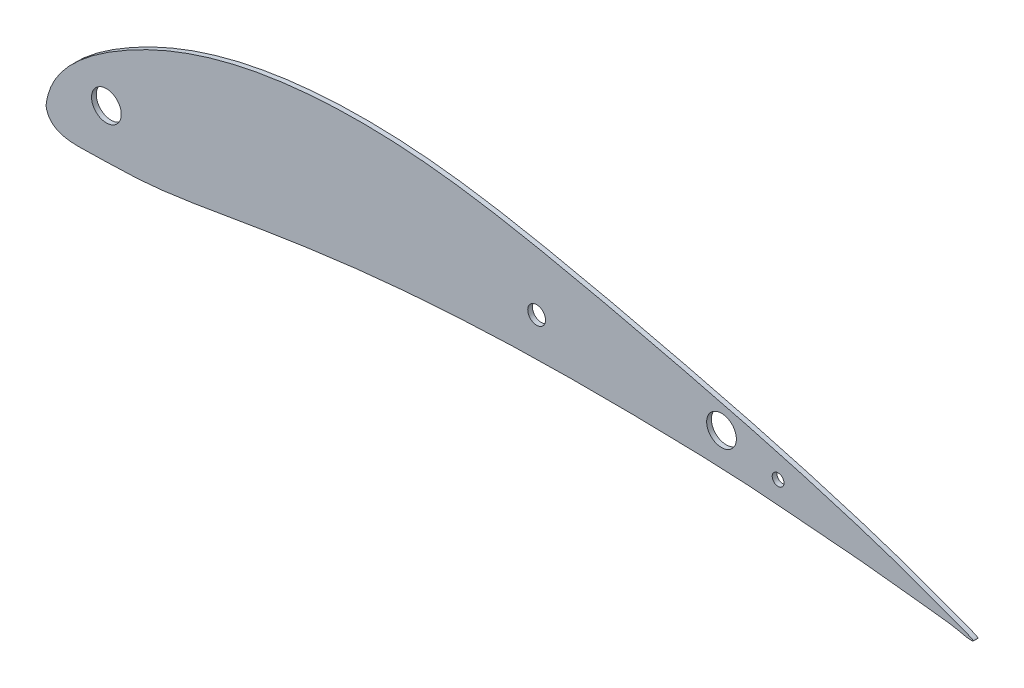
ISO-10303-21;
HEADER;
FILE_DESCRIPTION(('STEP AP214'),'2;1');
FILE_NAME('part.step','',(''),(''),'','','');
FILE_SCHEMA(('AUTOMOTIVE_DESIGN { 1 0 10303 214 1 1 1 1 }'));
ENDSEC;
DATA;
#1=APPLICATION_CONTEXT('core data for automotive mechanical design processes');
#2=APPLICATION_PROTOCOL_DEFINITION('international standard','automotive_design',2000,#1);
#3=PRODUCT_CONTEXT('',#1,'mechanical');
#4=PRODUCT('Part','Part','',(#3));
#5=PRODUCT_RELATED_PRODUCT_CATEGORY('part','',(#4));
#6=PRODUCT_DEFINITION_FORMATION('','',#4);
#7=PRODUCT_DEFINITION_CONTEXT('part definition',#1,'design');
#8=PRODUCT_DEFINITION('design','',#6,#7);
#9=PRODUCT_DEFINITION_SHAPE('','',#8);
#10=(LENGTH_UNIT() NAMED_UNIT(*) SI_UNIT(.MILLI.,.METRE.));
#11=(NAMED_UNIT(*) PLANE_ANGLE_UNIT() SI_UNIT($,.RADIAN.));
#12=(NAMED_UNIT(*) SI_UNIT($,.STERADIAN.) SOLID_ANGLE_UNIT());
#13=UNCERTAINTY_MEASURE_WITH_UNIT(LENGTH_MEASURE(1.E-05),#10,'distance_accuracy_value','');
#14=(GEOMETRIC_REPRESENTATION_CONTEXT(3) GLOBAL_UNCERTAINTY_ASSIGNED_CONTEXT((#13)) GLOBAL_UNIT_ASSIGNED_CONTEXT((#10,
#11,#12)) REPRESENTATION_CONTEXT('',''));
#15=CARTESIAN_POINT('',(0.,0.,0.));
#16=DIRECTION('',(0.,0.,1.));
#17=DIRECTION('',(1.,0.,0.));
#18=AXIS2_PLACEMENT_3D('',#15,#16,#17);
#19=CARTESIAN_POINT('',(0.000560351162113587,0.000130087070423624,1.5875));
#20=CARTESIAN_POINT('',(1.23071418869678,-6.92407609127206,1.5875));
#21=CARTESIAN_POINT('',(15.3166033306834,-6.18906584099094,1.5875));
#22=CARTESIAN_POINT('',(36.4546728163185,-6.09849990105009,1.5875));
#23=CARTESIAN_POINT('',(66.5061971849192,-0.586669106973501,1.5875));
#24=CARTESIAN_POINT('',(110.497331171581,6.18149522271792,1.5875));
#25=CARTESIAN_POINT('',(157.718638091679,9.03065014873911,1.5875));
#26=CARTESIAN_POINT('',(205.10142463584,8.83808028186313,1.5875));
#27=CARTESIAN_POINT('',(235.858814759408,7.87030619247826,1.5875));
#28=CARTESIAN_POINT('',(260.846344817159,5.42741339404395,1.5875));
#29=CARTESIAN_POINT('',(276.264022989737,4.51435670375389,1.5875));
#30=CARTESIAN_POINT('',(293.989507544058,2.09398731346533,1.5875));
#31=CARTESIAN_POINT('',(303.956832564589,1.47095520994628,1.5875));
#32=CARTESIAN_POINT('',(309.846313894505,0.000130087070423666,1.5875));
#33=B_SPLINE_CURVE_WITH_KNOTS('',3,(#19,#20,#21,#22,#23,#24,#25,#26,#27,#28,#29,#30,#31,#32),
.UNSPECIFIED.,.F.,.F.,(4,1,1,1,1,1,1,1,1,1,1,4),(0.,0.0569078595717698,0.106482711504673,
0.214488052979465,0.341297688349143,0.535095665520157,0.664680853556909,0.794660698192775,
0.828978881532905,0.904725108725214,0.942212919019968,1.),.UNSPECIFIED.);
#34=DIRECTION('',(0.,0.,-1.));
#35=VECTOR('',#34,1.);
#36=SURFACE_OF_LINEAR_EXTRUSION('',#33,#35);
#37=CARTESIAN_POINT('',(0.000560351162113587,0.000130087070423624,0.));
#38=CARTESIAN_POINT('',(1.23071418869678,-6.92407609127206,0.));
#39=CARTESIAN_POINT('',(15.3166033306834,-6.18906584099094,0.));
#40=CARTESIAN_POINT('',(36.4546728163185,-6.09849990105009,0.));
#41=CARTESIAN_POINT('',(66.5061971849192,-0.586669106973501,0.));
#42=CARTESIAN_POINT('',(110.497331171581,6.18149522271792,0.));
#43=CARTESIAN_POINT('',(157.718638091679,9.03065014873911,0.));
#44=CARTESIAN_POINT('',(205.10142463584,8.83808028186313,0.));
#45=CARTESIAN_POINT('',(235.858814759408,7.87030619247826,0.));
#46=CARTESIAN_POINT('',(260.846344817159,5.42741339404395,0.));
#47=CARTESIAN_POINT('',(276.264022989737,4.51435670375389,0.));
#48=CARTESIAN_POINT('',(293.989507544058,2.09398731346533,0.));
#49=CARTESIAN_POINT('',(303.956832564589,1.47095520994628,0.));
#50=CARTESIAN_POINT('',(309.846313894505,0.000130087070423666,0.));
#51=B_SPLINE_CURVE_WITH_KNOTS('',3,(#37,#38,#39,#40,#41,#42,#43,#44,#45,#46,#47,#48,#49,#50),
.UNSPECIFIED.,.F.,.F.,(4,1,1,1,1,1,1,1,1,1,1,4),(0.,0.0569078595717698,0.106482711504673,
0.214488052979465,0.341297688349143,0.535095665520157,0.664680853556909,0.794660698192775,
0.828978881532905,0.904725108725214,0.942212919019968,1.),.UNSPECIFIED.);
#52=CARTESIAN_POINT('',(0.000560351162116727,0.000130087070423829,0.));
#53=VERTEX_POINT('',#52);
#54=CARTESIAN_POINT('',(309.846313894505,0.000130087070423864,0.));
#55=VERTEX_POINT('',#54);
#56=EDGE_CURVE('E72',#53,#55,#51,.T.);
#57=ORIENTED_EDGE('',*,*,#56,.T.);
#58=DIRECTION('',(0.,0.,-1.));
#59=VECTOR('',#58,1.);
#60=CARTESIAN_POINT('',(309.846313894505,0.000130087070423864,1.5875));
#61=LINE('',#60,#59);
#62=CARTESIAN_POINT('',(309.846313894505,0.000130087070423864,1.5875));
#63=VERTEX_POINT('',#62);
#64=EDGE_CURVE('E11',#63,#55,#61,.T.);
#65=ORIENTED_EDGE('',*,*,#64,.F.);
#66=CARTESIAN_POINT('',(0.000560351162116727,0.000130087070423829,1.5875));
#67=VERTEX_POINT('',#66);
#68=EDGE_CURVE('E71',#67,#63,#33,.T.);
#69=ORIENTED_EDGE('',*,*,#68,.F.);
#70=DIRECTION('',(0.,0.,-1.));
#71=VECTOR('',#70,1.);
#72=CARTESIAN_POINT('',(0.000560351162116727,0.000130087070423829,1.5875));
#73=LINE('',#72,#71);
#74=EDGE_CURVE('E49',#67,#53,#73,.T.);
#75=ORIENTED_EDGE('',*,*,#74,.T.);
#76=EDGE_LOOP('',(#57,#65,#69,#75));
#77=FACE_BOUND('',#76,.T.);
#78=ADVANCED_FACE('F40',(#77),#36,.F.);
#79=CARTESIAN_POINT('',(309.846313894505,0.000130087070423864,1.5875));
#80=CARTESIAN_POINT('',(314.816918223261,-0.51620674157964,1.5875));
#81=CARTESIAN_POINT('',(301.273197720551,4.38282813873556,1.5875));
#82=CARTESIAN_POINT('',(290.359837670022,8.71099439045776,1.5875));
#83=CARTESIAN_POINT('',(256.952064400645,19.5289209482833,1.5875));
#84=CARTESIAN_POINT('',(217.961060472083,29.6129748944238,1.5875));
#85=CARTESIAN_POINT('',(173.256699242147,40.0411042779434,1.5875));
#86=CARTESIAN_POINT('',(131.400792108858,47.8848319151037,1.5875));
#87=CARTESIAN_POINT('',(89.5976184754884,49.290763053775,1.5875));
#88=CARTESIAN_POINT('',(52.1111282710831,42.0692152748914,1.5875));
#89=CARTESIAN_POINT('',(26.2867198183782,29.9751763284633,1.5875));
#90=CARTESIAN_POINT('',(8.64909202481883,17.8566051741579,1.5875));
#91=CARTESIAN_POINT('',(0.810633126632263,7.35919605469637,1.5875));
#92=CARTESIAN_POINT('',(0.000560351162116727,0.000130087070423829,1.5875));
#93=B_SPLINE_CURVE_WITH_KNOTS('',3,(#79,#80,#81,#82,#83,#84,#85,#86,#87,#88,#89,#90,#91,#92),
.UNSPECIFIED.,.F.,.F.,(4,1,1,1,1,1,1,1,1,1,1,4),(0.,0.0239417713693992,0.070244030177139,
0.147561721425381,0.308455887006792,0.442387865106874,0.551517565626309,0.687091076796298,
0.811391258419108,0.886311735305172,0.939136382225768,1.),.UNSPECIFIED.);
#94=DIRECTION('',(0.,0.,-1.));
#95=VECTOR('',#94,1.);
#96=SURFACE_OF_LINEAR_EXTRUSION('',#93,#95);
#97=CARTESIAN_POINT('',(309.846313894505,0.000130087070423864,0.));
#98=CARTESIAN_POINT('',(314.816918223261,-0.51620674157964,0.));
#99=CARTESIAN_POINT('',(301.273197720551,4.38282813873556,0.));
#100=CARTESIAN_POINT('',(290.359837670022,8.71099439045776,0.));
#101=CARTESIAN_POINT('',(256.952064400645,19.5289209482833,0.));
#102=CARTESIAN_POINT('',(217.961060472083,29.6129748944238,0.));
#103=CARTESIAN_POINT('',(173.256699242147,40.0411042779434,0.));
#104=CARTESIAN_POINT('',(131.400792108858,47.8848319151037,0.));
#105=CARTESIAN_POINT('',(89.5976184754884,49.290763053775,0.));
#106=CARTESIAN_POINT('',(52.1111282710831,42.0692152748914,0.));
#107=CARTESIAN_POINT('',(26.2867198183782,29.9751763284633,0.));
#108=CARTESIAN_POINT('',(8.64909202481883,17.8566051741579,0.));
#109=CARTESIAN_POINT('',(0.810633126632263,7.35919605469637,0.));
#110=CARTESIAN_POINT('',(0.000560351162116727,0.000130087070423829,0.));
#111=B_SPLINE_CURVE_WITH_KNOTS('',3,(#97,#98,#99,#100,#101,#102,#103,#104,#105,#106,#107,#108,
#109,#110),.UNSPECIFIED.,.F.,.F.,(4,1,1,1,1,1,1,1,1,1,1,4),(0.,0.0239417713693992,
0.070244030177139,0.147561721425381,0.308455887006792,0.442387865106874,0.551517565626309,
0.687091076796298,0.811391258419108,0.886311735305172,0.939136382225768,1.),.UNSPECIFIED.);
#112=EDGE_CURVE('E64',#55,#53,#111,.T.);
#113=ORIENTED_EDGE('',*,*,#112,.T.);
#114=ORIENTED_EDGE('',*,*,#74,.F.);
#115=EDGE_CURVE('E56',#63,#67,#93,.T.);
#116=ORIENTED_EDGE('',*,*,#115,.F.);
#117=ORIENTED_EDGE('',*,*,#64,.T.);
#118=EDGE_LOOP('',(#113,#114,#116,#117));
#119=FACE_BOUND('',#118,.T.);
#120=ADVANCED_FACE('F67',(#119),#96,.F.);
#121=CARTESIAN_POINT('',(153.387816973495,8.33338198857885,1.5875));
#122=DIRECTION('',(0.,0.,-1.));
#123=DIRECTION('',(-1.,0.,0.));
#124=AXIS2_PLACEMENT_3D('',#121,#122,#123);
#125=PLANE('',#124);
#126=CARTESIAN_POINT('',(165.100560351162,21.5901300870704,1.5875));
#127=DIRECTION('',(0.,0.,-1.));
#128=DIRECTION('',(-1.,0.,0.));
#129=AXIS2_PLACEMENT_3D('',#126,#127,#128);
#130=CIRCLE('',#129,2.99999999999999);
#131=CARTESIAN_POINT('',(162.100560351162,21.5901300870704,1.5875));
#132=VERTEX_POINT('',#131);
#133=EDGE_CURVE('E181',#132,#132,#130,.T.);
#134=ORIENTED_EDGE('',*,*,#133,.T.);
#135=EDGE_LOOP('',(#134));
#136=FACE_BOUND('',#135,.T.);
#137=CARTESIAN_POINT('',(20.32,10.16,1.5875));
#138=DIRECTION('',(0.,0.,1.));
#139=DIRECTION('',(1.,0.,0.));
#140=AXIS2_PLACEMENT_3D('',#137,#138,#139);
#141=CIRCLE('',#140,5.);
#142=CARTESIAN_POINT('',(25.32,10.16,1.5875));
#143=VERTEX_POINT('',#142);
#144=EDGE_CURVE('E79',#143,#143,#141,.T.);
#145=ORIENTED_EDGE('',*,*,#144,.F.);
#146=EDGE_LOOP('',(#145));
#147=FACE_BOUND('',#146,.T.);
#148=CARTESIAN_POINT('',(227.296313894505,19.0501300870704,1.5875));
#149=DIRECTION('',(0.,0.,1.));
#150=DIRECTION('',(1.,0.,0.));
#151=AXIS2_PLACEMENT_3D('',#148,#149,#150);
#152=CIRCLE('',#151,4.99999999999999);
#153=CARTESIAN_POINT('',(232.296313894505,19.0501300870704,1.5875));
#154=VERTEX_POINT('',#153);
#155=EDGE_CURVE('E193',#154,#154,#152,.T.);
#156=ORIENTED_EDGE('',*,*,#155,.F.);
#157=EDGE_LOOP('',(#156));
#158=FACE_BOUND('',#157,.T.);
#159=CARTESIAN_POINT('',(246.346313894505,14.2241300870704,1.5875));
#160=DIRECTION('',(0.,0.,1.));
#161=DIRECTION('',(1.,0.,0.));
#162=AXIS2_PLACEMENT_3D('',#159,#160,#161);
#163=CIRCLE('',#162,1.98437500000002);
#164=CARTESIAN_POINT('',(248.330688894505,14.2241300870704,1.5875));
#165=VERTEX_POINT('',#164);
#166=EDGE_CURVE('E182',#165,#165,#163,.T.);
#167=ORIENTED_EDGE('',*,*,#166,.F.);
#168=EDGE_LOOP('',(#167));
#169=FACE_BOUND('',#168,.T.);
#170=ORIENTED_EDGE('',*,*,#68,.T.);
#171=ORIENTED_EDGE('',*,*,#115,.T.);
#172=EDGE_LOOP('',(#170,#171));
#173=FACE_BOUND('',#172,.T.);
#174=ADVANCED_FACE('F104',(#136,#147,#158,#169,#173),#125,.F.);
#175=CARTESIAN_POINT('',(153.387816973495,8.33338198857885,0.));
#176=DIRECTION('',(0.,0.,-1.));
#177=DIRECTION('',(-1.,0.,0.));
#178=AXIS2_PLACEMENT_3D('',#175,#176,#177);
#179=PLANE('',#178);
#180=CARTESIAN_POINT('',(165.100560351162,21.5901300870704,0.));
#181=DIRECTION('',(0.,0.,-1.));
#182=DIRECTION('',(-1.,0.,0.));
#183=AXIS2_PLACEMENT_3D('',#180,#181,#182);
#184=CIRCLE('',#183,2.99999999999999);
#185=CARTESIAN_POINT('',(162.100560351162,21.5901300870704,0.));
#186=VERTEX_POINT('',#185);
#187=EDGE_CURVE('E178',#186,#186,#184,.T.);
#188=ORIENTED_EDGE('',*,*,#187,.F.);
#189=EDGE_LOOP('',(#188));
#190=FACE_BOUND('',#189,.T.);
#191=CARTESIAN_POINT('',(20.32,10.16,0.));
#192=DIRECTION('',(0.,0.,1.));
#193=DIRECTION('',(1.,0.,0.));
#194=AXIS2_PLACEMENT_3D('',#191,#192,#193);
#195=CIRCLE('',#194,5.);
#196=CARTESIAN_POINT('',(25.32,10.16,0.));
#197=VERTEX_POINT('',#196);
#198=EDGE_CURVE('E76',#197,#197,#195,.T.);
#199=ORIENTED_EDGE('',*,*,#198,.T.);
#200=EDGE_LOOP('',(#199));
#201=FACE_BOUND('',#200,.T.);
#202=CARTESIAN_POINT('',(227.296313894505,19.0501300870704,0.));
#203=DIRECTION('',(0.,0.,1.));
#204=DIRECTION('',(1.,0.,0.));
#205=AXIS2_PLACEMENT_3D('',#202,#203,#204);
#206=CIRCLE('',#205,4.99999999999999);
#207=CARTESIAN_POINT('',(232.296313894505,19.0501300870704,0.));
#208=VERTEX_POINT('',#207);
#209=EDGE_CURVE('E190',#208,#208,#206,.T.);
#210=ORIENTED_EDGE('',*,*,#209,.T.);
#211=EDGE_LOOP('',(#210));
#212=FACE_BOUND('',#211,.T.);
#213=CARTESIAN_POINT('',(246.346313894505,14.2241300870704,0.));
#214=DIRECTION('',(0.,0.,1.));
#215=DIRECTION('',(1.,0.,0.));
#216=AXIS2_PLACEMENT_3D('',#213,#214,#215);
#217=CIRCLE('',#216,1.98437500000002);
#218=CARTESIAN_POINT('',(248.330688894505,14.2241300870704,0.));
#219=VERTEX_POINT('',#218);
#220=EDGE_CURVE('E185',#219,#219,#217,.T.);
#221=ORIENTED_EDGE('',*,*,#220,.T.);
#222=EDGE_LOOP('',(#221));
#223=FACE_BOUND('',#222,.T.);
#224=ORIENTED_EDGE('',*,*,#56,.F.);
#225=ORIENTED_EDGE('',*,*,#112,.F.);
#226=EDGE_LOOP('',(#224,#225));
#227=FACE_BOUND('',#226,.T.);
#228=ADVANCED_FACE('F75',(#190,#201,#212,#223,#227),#179,.T.);
#229=CARTESIAN_POINT('',(246.346313894505,14.2241300870704,0.));
#230=DIRECTION('',(0.,0.,1.));
#231=DIRECTION('',(1.,0.,0.));
#232=AXIS2_PLACEMENT_3D('',#229,#230,#231);
#233=CYLINDRICAL_SURFACE('',#232,1.98437500000002);
#234=ORIENTED_EDGE('',*,*,#220,.F.);
#235=EDGE_LOOP('',(#234));
#236=FACE_BOUND('',#235,.T.);
#237=ORIENTED_EDGE('',*,*,#166,.T.);
#238=EDGE_LOOP('',(#237));
#239=FACE_BOUND('',#238,.T.);
#240=ADVANCED_FACE('F107',(#236,#239),#233,.F.);
#241=CARTESIAN_POINT('',(227.296313894505,19.0501300870704,0.));
#242=DIRECTION('',(0.,0.,1.));
#243=DIRECTION('',(1.,0.,0.));
#244=AXIS2_PLACEMENT_3D('',#241,#242,#243);
#245=CYLINDRICAL_SURFACE('',#244,4.99999999999999);
#246=ORIENTED_EDGE('',*,*,#209,.F.);
#247=EDGE_LOOP('',(#246));
#248=FACE_BOUND('',#247,.T.);
#249=ORIENTED_EDGE('',*,*,#155,.T.);
#250=EDGE_LOOP('',(#249));
#251=FACE_BOUND('',#250,.T.);
#252=ADVANCED_FACE('F114',(#248,#251),#245,.F.);
#253=CARTESIAN_POINT('',(20.32,10.16,0.));
#254=DIRECTION('',(0.,0.,1.));
#255=DIRECTION('',(1.,0.,0.));
#256=AXIS2_PLACEMENT_3D('',#253,#254,#255);
#257=CYLINDRICAL_SURFACE('',#256,5.);
#258=ORIENTED_EDGE('',*,*,#198,.F.);
#259=EDGE_LOOP('',(#258));
#260=FACE_BOUND('',#259,.T.);
#261=ORIENTED_EDGE('',*,*,#144,.T.);
#262=EDGE_LOOP('',(#261));
#263=FACE_BOUND('',#262,.T.);
#264=ADVANCED_FACE('F118',(#260,#263),#257,.F.);
#265=CARTESIAN_POINT('',(165.100560351162,21.5901300870704,2.54));
#266=DIRECTION('',(0.,0.,-1.));
#267=DIRECTION('',(-1.,0.,0.));
#268=AXIS2_PLACEMENT_3D('',#265,#266,#267);
#269=CYLINDRICAL_SURFACE('',#268,2.99999999999999);
#270=ORIENTED_EDGE('',*,*,#187,.T.);
#271=EDGE_LOOP('',(#270));
#272=FACE_BOUND('',#271,.T.);
#273=ORIENTED_EDGE('',*,*,#133,.F.);
#274=EDGE_LOOP('',(#273));
#275=FACE_BOUND('',#274,.T.);
#276=ADVANCED_FACE('F122',(#272,#275),#269,.F.);
#277=CLOSED_SHELL('',(#78,#120,#174,#228,#240,#252,#264,#276));
#278=MANIFOLD_SOLID_BREP('B2',#277);
#279=ADVANCED_BREP_SHAPE_REPRESENTATION('',(#18,#278),#14);
#280=SHAPE_DEFINITION_REPRESENTATION(#9,#279);
ENDSEC;
END-ISO-10303-21;
